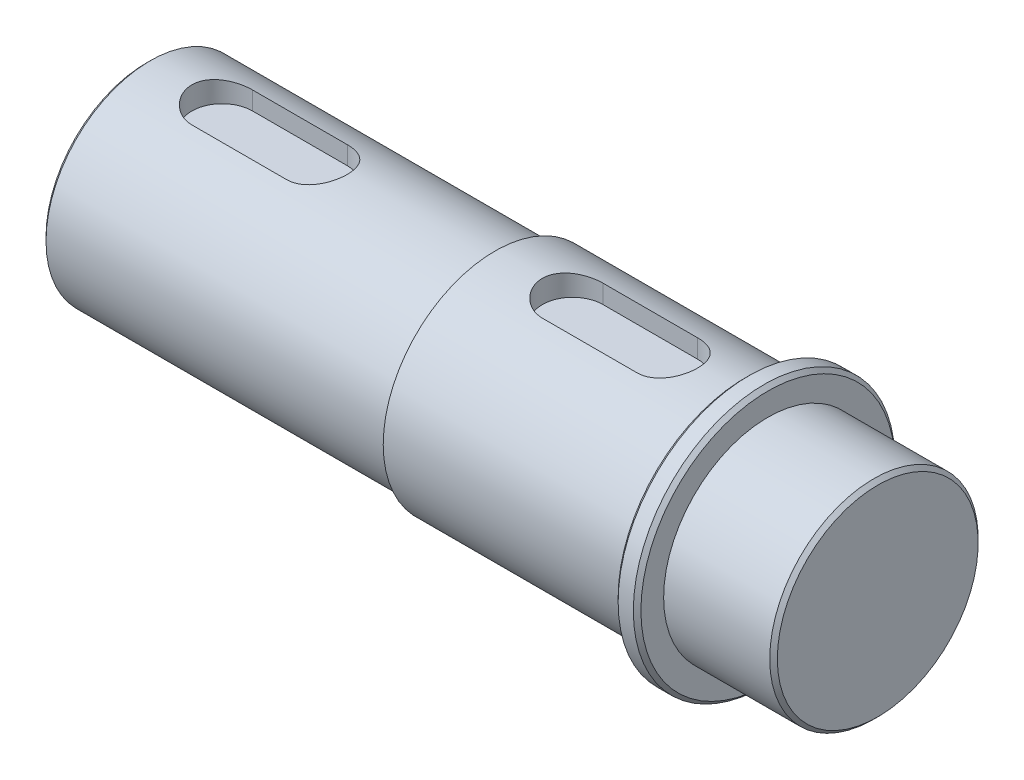
ISO-10303-21;
HEADER;
FILE_DESCRIPTION(('STEP AP214'),'2;1');
FILE_NAME('part.step','',(''),(''),'','','');
FILE_SCHEMA(('AUTOMOTIVE_DESIGN { 1 0 10303 214 1 1 1 1 }'));
ENDSEC;
DATA;
#1=APPLICATION_CONTEXT('core data for automotive mechanical design processes');
#2=APPLICATION_PROTOCOL_DEFINITION('international standard','automotive_design',2000,#1);
#3=PRODUCT_CONTEXT('',#1,'mechanical');
#4=PRODUCT('Part','Part','',(#3));
#5=PRODUCT_RELATED_PRODUCT_CATEGORY('part','',(#4));
#6=PRODUCT_DEFINITION_FORMATION('','',#4);
#7=PRODUCT_DEFINITION_CONTEXT('part definition',#1,'design');
#8=PRODUCT_DEFINITION('design','',#6,#7);
#9=PRODUCT_DEFINITION_SHAPE('','',#8);
#10=(LENGTH_UNIT() NAMED_UNIT(*) SI_UNIT(.MILLI.,.METRE.));
#11=(NAMED_UNIT(*) PLANE_ANGLE_UNIT() SI_UNIT($,.RADIAN.));
#12=(NAMED_UNIT(*) SI_UNIT($,.STERADIAN.) SOLID_ANGLE_UNIT());
#13=UNCERTAINTY_MEASURE_WITH_UNIT(LENGTH_MEASURE(1.E-05),#10,'distance_accuracy_value','');
#14=(GEOMETRIC_REPRESENTATION_CONTEXT(3) GLOBAL_UNCERTAINTY_ASSIGNED_CONTEXT((#13)) GLOBAL_UNIT_ASSIGNED_CONTEXT((#10,
#11,#12)) REPRESENTATION_CONTEXT('',''));
#15=CARTESIAN_POINT('',(0.,0.,0.));
#16=DIRECTION('',(0.,0.,1.));
#17=DIRECTION('',(1.,0.,0.));
#18=AXIS2_PLACEMENT_3D('',#15,#16,#17);
#19=CARTESIAN_POINT('',(-72.236328125,0.,0.));
#20=DIRECTION('',(-1.,0.,0.));
#21=DIRECTION('',(0.,0.,1.));
#22=AXIS2_PLACEMENT_3D('',#19,#20,#21);
#23=CYLINDRICAL_SURFACE('',#22,27.5);
#24=DIRECTION('',(-1.,0.,0.));
#25=VECTOR('',#24,1.);
#26=CARTESIAN_POINT('',(-72.236328125,26.3106442338457,-8.00000000000001));
#27=LINE('',#26,#25);
#28=CARTESIAN_POINT('',(-102.649564477172,26.3106442338457,-8.));
#29=VERTEX_POINT('',#28);
#30=CARTESIAN_POINT('',(-77.6495644771724,26.3106442338457,-8.00000000000001));
#31=VERTEX_POINT('',#30);
#32=EDGE_CURVE('E11',#29,#31,#27,.F.);
#33=ORIENTED_EDGE('',*,*,#32,.T.);
#34=CARTESIAN_POINT('',(-77.6495644771724,26.3106442338457,-8.00000000000001));
#35=CARTESIAN_POINT('',(-77.4296780071949,26.3106138464805,-8.00002941250954));
#36=CARTESIAN_POINT('',(-77.2098024997153,26.31339970325,-7.99093569772388));
#37=CARTESIAN_POINT('',(-76.7717228733047,26.3243821575892,-7.95471953682609));
#38=CARTESIAN_POINT('',(-76.5535184074534,26.3325775994905,-7.92760094142266));
#39=CARTESIAN_POINT('',(-76.1208594969072,26.3541315251911,-7.85563960143699));
#40=CARTESIAN_POINT('',(-75.9063972512507,26.3674774590875,-7.8108399333227));
#41=CARTESIAN_POINT('',(-75.4821909245238,26.3989164788629,-7.70391661710105));
#42=CARTESIAN_POINT('',(-75.2724469552904,26.4170096771374,-7.64179255882136));
#43=CARTESIAN_POINT('',(-74.8592222599551,26.4573947181872,-7.5007752502961));
#44=CARTESIAN_POINT('',(-74.6557382491932,26.4796843137982,-7.42189097222974));
#45=CARTESIAN_POINT('',(-74.2561702767961,26.5278301044113,-7.24792208748818));
#46=CARTESIAN_POINT('',(-74.0600890909107,26.5536876206464,-7.15283147638136));
#47=CARTESIAN_POINT('',(-73.6766016595221,26.6082392780648,-6.94715180070415));
#48=CARTESIAN_POINT('',(-73.4891970176153,26.63693394056,-6.83655988627862));
#49=CARTESIAN_POINT('',(-73.1242322419529,26.6963706560259,-6.60065041990191));
#50=CARTESIAN_POINT('',(-72.946672621986,26.7271128156666,-6.47533210047654));
#51=CARTESIAN_POINT('',(-72.5978569933504,26.7906616850295,-6.20724750295723));
#52=CARTESIAN_POINT('',(-72.4268967897024,26.8235016269389,-6.06410407777578));
#53=CARTESIAN_POINT('',(-72.0975525979029,26.8895667993442,-5.76409444246167));
#54=CARTESIAN_POINT('',(-71.9391688113413,26.9227920360062,-5.60722801244495));
#55=CARTESIAN_POINT('',(-71.6359611617057,26.9887294799426,-5.28074002072183));
#56=CARTESIAN_POINT('',(-71.4911397460333,27.0214415937379,-5.11111616679038));
#57=CARTESIAN_POINT('',(-71.2160502456882,27.0854611714506,-4.76020963887573));
#58=CARTESIAN_POINT('',(-71.085781746033,27.1167686754057,-4.57892729757152));
#59=CARTESIAN_POINT('',(-70.8382914521447,27.1777256203921,-4.20218325463039));
#60=CARTESIAN_POINT('',(-70.7213754203031,27.2073305358195,-4.00651327777908));
#61=CARTESIAN_POINT('',(-70.504539849176,27.2633528032334,-3.60562548789431));
#62=CARTESIAN_POINT('',(-70.4046141264575,27.2897713138544,-3.40041118318973));
#63=CARTESIAN_POINT('',(-70.2225196117825,27.3386777186889,-2.98179504822865));
#64=CARTESIAN_POINT('',(-70.14035065383,27.3611656496463,-2.76839329453302));
#65=CARTESIAN_POINT('',(-69.994480858399,27.4015581404782,-2.33494709067877));
#66=CARTESIAN_POINT('',(-69.9307794289852,27.4194628472555,-2.11490285367981));
#67=CARTESIAN_POINT('',(-69.8238851789,27.4497486455739,-1.67583141298472));
#68=CARTESIAN_POINT('',(-69.7801853830538,27.4622657370543,-1.45693695871637));
#69=CARTESIAN_POINT('',(-69.7112107726193,27.4821099190102,-1.01603367718328));
#70=CARTESIAN_POINT('',(-69.6859354061449,27.4894371649423,-0.794024943406845));
#71=CARTESIAN_POINT('',(-69.6540447895467,27.4986927278334,-0.348590871405764));
#72=CARTESIAN_POINT('',(-69.6474268628739,27.5006218191976,-0.125165740983363));
#73=CARTESIAN_POINT('',(-69.652905917945,27.4990279887972,0.321433410377634));
#74=CARTESIAN_POINT('',(-69.665002578425,27.4955051606228,0.544607435561012));
#75=CARTESIAN_POINT('',(-69.7071490319084,27.4832962687889,0.982297226132276));
#76=CARTESIAN_POINT('',(-69.736645763659,27.4747693029177,1.19687096756623));
#77=CARTESIAN_POINT('',(-69.8128894314247,27.4529077240824,1.62275603314308));
#78=CARTESIAN_POINT('',(-69.8596421501294,27.439571499512,1.83406623887595));
#79=CARTESIAN_POINT('',(-69.9699856343809,27.4084500368961,2.25182822398416));
#80=CARTESIAN_POINT('',(-70.0335707937317,27.3906662802501,2.4582815960893));
#81=CARTESIAN_POINT('',(-70.1771019190777,27.351104898212,2.86510907670465));
#82=CARTESIAN_POINT('',(-70.2570540314759,27.3293257727297,3.06548086879901));
#83=CARTESIAN_POINT('',(-70.4336467565396,27.2820848729817,3.46091415190038));
#84=CARTESIAN_POINT('',(-70.5304587576183,27.256585763757,3.65589461195646));
#85=CARTESIAN_POINT('',(-70.7394854451162,27.2027387344194,4.03708759342219));
#86=CARTESIAN_POINT('',(-70.8517054213607,27.1743898368239,4.22329707398687));
#87=CARTESIAN_POINT('',(-71.0907453506977,27.1155802508097,4.58574078126312));
#88=CARTESIAN_POINT('',(-71.2175653116948,27.0851195612476,4.76197500257392));
#89=CARTESIAN_POINT('',(-71.4849756662639,27.0228653268412,5.10341760762337));
#90=CARTESIAN_POINT('',(-71.6255664360921,26.9910717455921,5.26862568989025));
#91=CARTESIAN_POINT('',(-71.9250029868779,26.9257959685715,5.59283881339114));
#92=CARTESIAN_POINT('',(-72.0843273665496,26.892294463267,5.75139827430256));
#93=CARTESIAN_POINT('',(-72.4157352489545,26.8256711887099,6.05453947809949));
#94=CARTESIAN_POINT('',(-72.5878146077779,26.7925493001282,6.19912572581623));
#95=CARTESIAN_POINT('',(-72.9438007486166,26.7275807630162,6.47350928570368));
#96=CARTESIAN_POINT('',(-73.1277152659484,26.6957349710469,6.60329676880377));
#97=CARTESIAN_POINT('',(-73.5060183451869,26.6342666832458,6.84701637082592));
#98=CARTESIAN_POINT('',(-73.7004028005212,26.6046433264724,6.96095464428324));
#99=CARTESIAN_POINT('',(-74.1003399776535,26.5482097665725,7.17319581827482));
#100=CARTESIAN_POINT('',(-74.3059813697305,26.5214290138552,7.27133962598134));
#101=CARTESIAN_POINT('',(-74.7252144811759,26.4718440062477,7.4498360954572));
#102=CARTESIAN_POINT('',(-74.9388029226328,26.4490381334307,7.53019599955862));
#103=CARTESIAN_POINT('',(-75.3722469478454,26.408136714196,7.67240466982567));
#104=CARTESIAN_POINT('',(-75.5920957001232,26.3900362363208,7.73427282641309));
#105=CARTESIAN_POINT('',(-76.0365421472798,26.3591107233259,7.83902146376045));
#106=CARTESIAN_POINT('',(-76.2611375950409,26.3462832482518,7.88191072724793));
#107=CARTESIAN_POINT('',(-76.6796384802549,26.3278154627767,7.94336457833749));
#108=CARTESIAN_POINT('',(-76.8731209379449,26.3213881635008,7.96460439152622));
#109=CARTESIAN_POINT('',(-77.2609187319362,26.312796865776,7.99291944032766));
#110=CARTESIAN_POINT('',(-77.4552323694083,26.3106264443285,8.00001601625351));
#111=CARTESIAN_POINT('',(-77.6495644771724,26.3106442338457,8.));
#112=B_SPLINE_CURVE_WITH_KNOTS('',3,(#34,#35,#36,#37,#38,#39,#40,#41,#42,#43,#44,#45,#46,#47,
#48,#49,#50,#51,#52,#53,#54,#55,#56,#57,#58,#59,#60,#61,#62,#63,#64,#65,#66,#67,#68,#69,#70,#71,
#72,#73,#74,#75,#76,#77,#78,#79,#80,#81,#82,#83,#84,#85,#86,#87,#88,#89,#90,#91,#92,#93,#94,#95,
#96,#97,#98,#99,#100,#101,#102,#103,#104,#105,#106,#107,#108,#109,#110,#111),.UNSPECIFIED.,.F.,
.F.,(4,2,2,2,2,2,2,2,2,2,2,2,2,2,2,2,2,2,2,2,2,2,2,2,2,2,2,2,2,2,2,2,2,2,2,2,2,2,4),(0.,
0.659436943554262,1.31873305489964,1.97643273881418,2.63414799575145,3.29151204385043,
3.94912017630673,4.60684936645656,5.26461284971652,5.93997685054219,6.61535167472507,
7.29084813997373,7.96632533824111,8.65504200191302,9.3435074758537,10.0319665135188,
10.7204034817235,11.3902655139289,12.0601074802365,12.7298533478211,13.3995877183439,
14.0491017024096,14.6988335443704,15.348349258952,15.9981093399168,16.6549076019857,
17.311931920769,17.968956595273,18.6259992264999,19.3069904712947,19.9877614334311,
20.668981949418,21.3499371922363,22.0373719853152,22.72452630958,23.4109575362285,
24.0970707749295,24.6807726695567,25.2635931648055),.UNSPECIFIED.);
#113=CARTESIAN_POINT('',(-77.6495644771724,26.3106442338457,8.));
#114=VERTEX_POINT('',#113);
#115=EDGE_CURVE('E271',#31,#114,#112,.T.);
#116=ORIENTED_EDGE('',*,*,#115,.T.);
#117=DIRECTION('',(-1.,0.,0.));
#118=VECTOR('',#117,1.);
#119=CARTESIAN_POINT('',(-72.236328125,26.3106442338457,8.));
#120=LINE('',#119,#118);
#121=CARTESIAN_POINT('',(-102.649564477172,26.3106442338457,8.));
#122=VERTEX_POINT('',#121);
#123=EDGE_CURVE('E48',#114,#122,#120,.T.);
#124=ORIENTED_EDGE('',*,*,#123,.T.);
#125=CARTESIAN_POINT('',(-102.649564477172,26.3106442338457,8.00000000000001));
#126=CARTESIAN_POINT('',(-102.86945094715,26.3106138464805,8.00002941250955));
#127=CARTESIAN_POINT('',(-103.08932645463,26.31339970325,7.99093569772388));
#128=CARTESIAN_POINT('',(-103.52740608104,26.3243821575892,7.9547195368261));
#129=CARTESIAN_POINT('',(-103.745610546891,26.3325775994905,7.92760094142266));
#130=CARTESIAN_POINT('',(-104.178269457438,26.3541315251911,7.85563960143699));
#131=CARTESIAN_POINT('',(-104.392731703094,26.3674774590875,7.8108399333227));
#132=CARTESIAN_POINT('',(-104.816938029821,26.3989164788629,7.70391661710106));
#133=CARTESIAN_POINT('',(-105.026681999054,26.4170096771374,7.64179255882136));
#134=CARTESIAN_POINT('',(-105.43990669439,26.4573947181872,7.5007752502961));
#135=CARTESIAN_POINT('',(-105.643390705152,26.4796843137982,7.42189097222975));
#136=CARTESIAN_POINT('',(-106.042958677549,26.5278301044113,7.2479220874882));
#137=CARTESIAN_POINT('',(-106.239039863434,26.5536876206464,7.15283147638138));
#138=CARTESIAN_POINT('',(-106.622527294823,26.6082392780648,6.94715180070416));
#139=CARTESIAN_POINT('',(-106.80993193673,26.63693394056,6.83655988627864));
#140=CARTESIAN_POINT('',(-107.174896712392,26.6963706560259,6.60065041990191));
#141=CARTESIAN_POINT('',(-107.352456332359,26.7271128156666,6.47533210047654));
#142=CARTESIAN_POINT('',(-107.701271960994,26.7906616850295,6.20724750295723));
#143=CARTESIAN_POINT('',(-107.872232164642,26.8235016269389,6.06410407777578));
#144=CARTESIAN_POINT('',(-108.201576356442,26.8895667993442,5.76409444246167));
#145=CARTESIAN_POINT('',(-108.359960143003,26.9227920360062,5.60722801244496));
#146=CARTESIAN_POINT('',(-108.663167792639,26.9887294799426,5.28074002072183));
#147=CARTESIAN_POINT('',(-108.807989208311,27.0214415937379,5.11111616679039));
#148=CARTESIAN_POINT('',(-109.083078708657,27.0854611714506,4.76020963887574));
#149=CARTESIAN_POINT('',(-109.213347208312,27.1167686754057,4.57892729757152));
#150=CARTESIAN_POINT('',(-109.4608375022,27.1777256203921,4.20218325463039));
#151=CARTESIAN_POINT('',(-109.577753534042,27.2073305358195,4.00651327777909));
#152=CARTESIAN_POINT('',(-109.794589105169,27.2633528032334,3.60562548789431));
#153=CARTESIAN_POINT('',(-109.894514827887,27.2897713138544,3.40041118318973));
#154=CARTESIAN_POINT('',(-110.076609342562,27.3386777186889,2.98179504822865));
#155=CARTESIAN_POINT('',(-110.158778300515,27.3611656496463,2.76839329453302));
#156=CARTESIAN_POINT('',(-110.304648095946,27.4015581404782,2.33494709067877));
#157=CARTESIAN_POINT('',(-110.36834952536,27.4194628472555,2.11490285367982));
#158=CARTESIAN_POINT('',(-110.475243775445,27.4497486455739,1.67583141298472));
#159=CARTESIAN_POINT('',(-110.518943571291,27.4622657370543,1.45693695871637));
#160=CARTESIAN_POINT('',(-110.587918181726,27.4821099190102,1.01603367718329));
#161=CARTESIAN_POINT('',(-110.6131935482,27.4894371649423,0.794024943406851));
#162=CARTESIAN_POINT('',(-110.645084164798,27.4986927278334,0.348590871405771));
#163=CARTESIAN_POINT('',(-110.651702091471,27.5006218191976,0.12516574098337));
#164=CARTESIAN_POINT('',(-110.6462230364,27.4990279887972,-0.321433410377626));
#165=CARTESIAN_POINT('',(-110.63412637592,27.4955051606228,-0.544607435561004));
#166=CARTESIAN_POINT('',(-110.591979922436,27.4832962687889,-0.982297226132268));
#167=CARTESIAN_POINT('',(-110.562483190686,27.4747693029177,-1.19687096756622));
#168=CARTESIAN_POINT('',(-110.48623952292,27.4529077240824,-1.62275603314307));
#169=CARTESIAN_POINT('',(-110.439486804215,27.439571499512,-1.83406623887594));
#170=CARTESIAN_POINT('',(-110.329143319964,27.4084500368961,-2.25182822398415));
#171=CARTESIAN_POINT('',(-110.265558160613,27.3906662802501,-2.4582815960893));
#172=CARTESIAN_POINT('',(-110.122027035267,27.351104898212,-2.86510907670465));
#173=CARTESIAN_POINT('',(-110.042074922869,27.3293257727297,-3.06548086879901));
#174=CARTESIAN_POINT('',(-109.865482197805,27.2820848729817,-3.46091415190038));
#175=CARTESIAN_POINT('',(-109.768670196727,27.256585763757,-3.65589461195646));
#176=CARTESIAN_POINT('',(-109.559643509229,27.2027387344194,-4.03708759342219));
#177=CARTESIAN_POINT('',(-109.447423532984,27.1743898368239,-4.22329707398687));
#178=CARTESIAN_POINT('',(-109.208383603647,27.1155802508097,-4.58574078126311));
#179=CARTESIAN_POINT('',(-109.08156364265,27.0851195612476,-4.76197500257391));
#180=CARTESIAN_POINT('',(-108.814153288081,27.0228653268412,-5.10341760762337));
#181=CARTESIAN_POINT('',(-108.673562518253,26.9910717455921,-5.26862568989025));
#182=CARTESIAN_POINT('',(-108.374125967467,26.9257959685715,-5.59283881339113));
#183=CARTESIAN_POINT('',(-108.214801587795,26.892294463267,-5.75139827430255));
#184=CARTESIAN_POINT('',(-107.88339370539,26.8256711887099,-6.05453947809948));
#185=CARTESIAN_POINT('',(-107.711314346567,26.7925493001282,-6.19912572581623));
#186=CARTESIAN_POINT('',(-107.355328205728,26.7275807630162,-6.47350928570367));
#187=CARTESIAN_POINT('',(-107.171413688396,26.6957349710469,-6.60329676880377));
#188=CARTESIAN_POINT('',(-106.793110609158,26.6342666832458,-6.84701637082592));
#189=CARTESIAN_POINT('',(-106.598726153824,26.6046433264724,-6.96095464428324));
#190=CARTESIAN_POINT('',(-106.198788976691,26.5482097665725,-7.17319581827481));
#191=CARTESIAN_POINT('',(-105.993147584614,26.5214290138552,-7.27133962598134));
#192=CARTESIAN_POINT('',(-105.573914473169,26.4718440062477,-7.44983609545719));
#193=CARTESIAN_POINT('',(-105.360326031712,26.4490381334307,-7.53019599955861));
#194=CARTESIAN_POINT('',(-104.926882006499,26.408136714196,-7.67240466982567));
#195=CARTESIAN_POINT('',(-104.707033254222,26.3900362363208,-7.73427282641309));
#196=CARTESIAN_POINT('',(-104.262586807065,26.3591107233259,-7.83902146376045));
#197=CARTESIAN_POINT('',(-104.037991359304,26.3462832482518,-7.88191072724792));
#198=CARTESIAN_POINT('',(-103.61949047409,26.3278154627766,-7.94336457833749));
#199=CARTESIAN_POINT('',(-103.4260080164,26.3213881635008,-7.96460439152622));
#200=CARTESIAN_POINT('',(-103.038210222409,26.312796865776,-7.99291944032765));
#201=CARTESIAN_POINT('',(-102.843896584937,26.3106264443285,-8.0000160162535));
#202=CARTESIAN_POINT('',(-102.649564477172,26.3106442338457,-8.));
#203=B_SPLINE_CURVE_WITH_KNOTS('',3,(#125,#126,#127,#128,#129,#130,#131,#132,#133,#134,#135,
#136,#137,#138,#139,#140,#141,#142,#143,#144,#145,#146,#147,#148,#149,#150,#151,#152,#153,#154,
#155,#156,#157,#158,#159,#160,#161,#162,#163,#164,#165,#166,#167,#168,#169,#170,#171,#172,#173,
#174,#175,#176,#177,#178,#179,#180,#181,#182,#183,#184,#185,#186,#187,#188,#189,#190,#191,#192,
#193,#194,#195,#196,#197,#198,#199,#200,#201,#202),.UNSPECIFIED.,.F.,.F.,(4,2,2,2,2,2,2,2,2,2,2,
2,2,2,2,2,2,2,2,2,2,2,2,2,2,2,2,2,2,2,2,2,2,2,2,2,2,2,4),(0.,0.659436943554262,1.31873305489964,
1.97643273881418,2.63414799575145,3.29151204385042,3.9491201763067,4.60684936645656,
5.26461284971653,5.93997685054219,6.61535167472507,7.29084813997373,7.96632533824112,
8.65504200191302,9.3435074758537,10.0319665135188,10.7204034817235,11.3902655139289,
12.0601074802365,12.7298533478211,13.3995877183439,14.0491017024096,14.6988335443704,
15.348349258952,15.9981093399168,16.6549076019857,17.311931920769,17.968956595273,
18.6259992264998,19.3069904712947,19.9877614334311,20.668981949418,21.3499371922363,
22.0373719853152,22.72452630958,23.4109575362285,24.0970707749295,24.6807726695567,
25.2635931648055),.UNSPECIFIED.);
#204=EDGE_CURVE('E55',#122,#29,#203,.T.);
#205=ORIENTED_EDGE('',*,*,#204,.T.);
#206=EDGE_LOOP('',(#33,#116,#124,#205));
#207=FACE_BOUND('',#206,.T.);
#208=CARTESIAN_POINT('',(-121.649564477172,0.,0.));
#209=DIRECTION('',(-1.,0.,0.));
#210=DIRECTION('',(0.,0.,1.));
#211=AXIS2_PLACEMENT_3D('',#208,#209,#210);
#212=CIRCLE('',#211,27.5);
#213=CARTESIAN_POINT('',(-121.649564477172,0.,27.5));
#214=VERTEX_POINT('',#213);
#215=EDGE_CURVE('E308',#214,#214,#212,.F.);
#216=ORIENTED_EDGE('',*,*,#215,.T.);
#217=EDGE_LOOP('',(#216));
#218=FACE_BOUND('',#217,.T.);
#219=CARTESIAN_POINT('',(-30.6599694272612,0.,0.));
#220=DIRECTION('',(-1.,0.,0.));
#221=DIRECTION('',(0.,0.,1.));
#222=AXIS2_PLACEMENT_3D('',#219,#220,#221);
#223=CIRCLE('',#222,27.5);
#224=CARTESIAN_POINT('',(-30.6599694272612,0.,27.5));
#225=VERTEX_POINT('',#224);
#226=EDGE_CURVE('E186',#225,#225,#223,.T.);
#227=ORIENTED_EDGE('',*,*,#226,.T.);
#228=EDGE_LOOP('',(#227));
#229=FACE_BOUND('',#228,.T.);
#230=ADVANCED_FACE('F39',(#207,#218,#229),#23,.T.);
#231=CARTESIAN_POINT('',(-30.6599694272612,27.5,0.));
#232=DIRECTION('',(1.,0.,0.));
#233=DIRECTION('',(0.,0.,-1.));
#234=AXIS2_PLACEMENT_3D('',#231,#232,#233);
#235=PLANE('',#234);
#236=ORIENTED_EDGE('',*,*,#226,.F.);
#237=EDGE_LOOP('',(#236));
#238=FACE_BOUND('',#237,.T.);
#239=CARTESIAN_POINT('',(-30.6599694272612,0.,0.));
#240=DIRECTION('',(-1.,0.,0.));
#241=DIRECTION('',(0.,0.,1.));
#242=AXIS2_PLACEMENT_3D('',#239,#240,#241);
#243=CIRCLE('',#242,29.5);
#244=CARTESIAN_POINT('',(-30.6599694272612,0.,29.5));
#245=VERTEX_POINT('',#244);
#246=EDGE_CURVE('E183',#245,#245,#243,.T.);
#247=ORIENTED_EDGE('',*,*,#246,.T.);
#248=EDGE_LOOP('',(#247));
#249=FACE_BOUND('',#248,.T.);
#250=ADVANCED_FACE('F257',(#238,#249),#235,.F.);
#251=CARTESIAN_POINT('',(-72.236328125,0.,0.));
#252=DIRECTION('',(-1.,0.,0.));
#253=DIRECTION('',(0.,0.,1.));
#254=AXIS2_PLACEMENT_3D('',#251,#252,#253);
#255=CYLINDRICAL_SURFACE('',#254,29.5);
#256=DIRECTION('',(-1.,0.,0.));
#257=VECTOR('',#256,1.);
#258=CARTESIAN_POINT('',(-72.236328125,28.3945417290014,-8.));
#259=LINE('',#258,#257);
#260=CARTESIAN_POINT('',(-10.16796875,28.3945417290014,-8.));
#261=VERTEX_POINT('',#260);
#262=CARTESIAN_POINT('',(14.83203125,28.3945417290014,-8.));
#263=VERTEX_POINT('',#262);
#264=EDGE_CURVE('E304',#261,#263,#259,.F.);
#265=ORIENTED_EDGE('',*,*,#264,.T.);
#266=CARTESIAN_POINT('',(14.83203125,28.3945417290014,-8.));
#267=CARTESIAN_POINT('',(15.0525953036408,28.3945137300031,-8.00002873258341));
#268=CARTESIAN_POINT('',(15.2731494297406,28.3971107416837,-7.99087969855075));
#269=CARTESIAN_POINT('',(15.7125949563254,28.407350729619,-7.9544380167304));
#270=CARTESIAN_POINT('',(15.9314866658295,28.4149927436477,-7.92714882878074));
#271=CARTESIAN_POINT('',(16.3655721709091,28.4350967022898,-7.85471830953825));
#272=CARTESIAN_POINT('',(16.5807730378087,28.4475480143213,-7.80961635448144));
#273=CARTESIAN_POINT('',(17.0064530282195,28.476886215605,-7.70195312233185));
#274=CARTESIAN_POINT('',(17.216932063586,28.4937731875852,-7.63939151960385));
#275=CARTESIAN_POINT('',(17.6316340064883,28.5314762838,-7.49734930321021));
#276=CARTESIAN_POINT('',(17.8358595212011,28.5522907439577,-7.4178758532798));
#277=CARTESIAN_POINT('',(18.2368732528747,28.5972591639657,-7.24257930082531));
#278=CARTESIAN_POINT('',(18.4336586838016,28.6214143593302,-7.14675014633814));
#279=CARTESIAN_POINT('',(18.8184772700603,28.6723798834938,-6.93945378728573));
#280=CARTESIAN_POINT('',(19.0065094529764,28.6991905062596,-6.82798485076128));
#281=CARTESIAN_POINT('',(19.3726379397121,28.7547275906951,-6.59018549073986));
#282=CARTESIAN_POINT('',(19.5507337635352,28.7834541447709,-6.46385435020784));
#283=CARTESIAN_POINT('',(19.8999012431933,28.8427290154732,-6.19406902336904));
#284=CARTESIAN_POINT('',(20.0707139618412,28.8733041389878,-6.05028549182505));
#285=CARTESIAN_POINT('',(20.3996986018352,28.9348025736478,-5.74898560012509));
#286=CARTESIAN_POINT('',(20.5578703436484,28.9657258897312,-5.59146904499271));
#287=CARTESIAN_POINT('',(20.8605744155748,29.0270797186178,-5.263690912739));
#288=CARTESIAN_POINT('',(21.0051043380288,29.0575101436478,-5.09342709531302));
#289=CARTESIAN_POINT('',(21.279523868633,29.1170433893146,-4.74127275998858));
#290=CARTESIAN_POINT('',(21.4094138839933,29.1461462468643,-4.55938256569937));
#291=CARTESIAN_POINT('',(21.6557151650685,29.2027061877709,-4.1819805684317));
#292=CARTESIAN_POINT('',(21.7718622739818,29.2301272531681,-3.98629081646132));
#293=CARTESIAN_POINT('',(21.9871683617023,29.2819922328797,-3.58549056321194));
#294=CARTESIAN_POINT('',(22.0863334794982,29.3064372221177,-3.3803835004372));
#295=CARTESIAN_POINT('',(22.2669347461933,29.3516633687544,-2.96211089448301));
#296=CARTESIAN_POINT('',(22.3483707758871,29.3724445015181,-2.74894529713157));
#297=CARTESIAN_POINT('',(22.4928233744169,29.4097409387248,-2.3160991123042));
#298=CARTESIAN_POINT('',(22.5558404522017,29.4262563610355,-2.09641870502896));
#299=CARTESIAN_POINT('',(22.6616340817183,29.45420410269,-1.65743307467072));
#300=CARTESIAN_POINT('',(22.7048537342717,29.4657473150411,-1.4382416530421));
#301=CARTESIAN_POINT('',(22.7728261094449,29.4839812126967,-0.996816150517385));
#302=CARTESIAN_POINT('',(22.7975793097422,29.4906720235197,-0.774582148476111));
#303=CARTESIAN_POINT('',(22.8283955843607,29.4990105258922,-0.328754936806277));
#304=CARTESIAN_POINT('',(22.834460950463,29.5006588358282,-0.105161897213193));
#305=CARTESIAN_POINT('',(22.8278526401904,29.4988669076861,0.341724870778752));
#306=CARTESIAN_POINT('',(22.8151792403925,29.4954267447119,0.56501860354658));
#307=CARTESIAN_POINT('',(22.7717885675489,29.4837128970159,1.00377738828183));
#308=CARTESIAN_POINT('',(22.7415545338228,29.4755686918384,1.21929390138203));
#309=CARTESIAN_POINT('',(22.6636737861096,29.4547656137756,1.64701010106457));
#310=CARTESIAN_POINT('',(22.6160212110556,29.4421052212985,1.85920864611158));
#311=CARTESIAN_POINT('',(22.5037155199283,29.4126130768089,2.27868140448176));
#312=CARTESIAN_POINT('',(22.4390680674898,29.3957827145688,2.48595723328236));
#313=CARTESIAN_POINT('',(22.2932493042053,29.3583856897314,2.8943489967999));
#314=CARTESIAN_POINT('',(22.2120717990198,29.33781762681,3.09546258973136));
#315=CARTESIAN_POINT('',(22.03294442662,29.293268077745,3.49208573877809));
#316=CARTESIAN_POINT('',(21.9348377344711,29.2692550654282,3.68752090181133));
#317=CARTESIAN_POINT('',(21.7230945462069,29.2185931719764,4.06951516671499));
#318=CARTESIAN_POINT('',(21.6094527086951,29.1919433851224,4.25607118582671));
#319=CARTESIAN_POINT('',(21.3674554311723,29.1367104574649,4.61907055779654));
#320=CARTESIAN_POINT('',(21.2391003391136,29.1081273623886,4.79551414965446));
#321=CARTESIAN_POINT('',(20.968520651498,29.0497685728195,5.13721661246417));
#322=CARTESIAN_POINT('',(20.8262957293187,29.0199928502512,5.30247521986399));
#323=CARTESIAN_POINT('',(20.5241419426048,28.9590666760117,5.6258678959394));
#324=CARTESIAN_POINT('',(20.3637936858452,28.9279026321938,5.78360781860587));
#325=CARTESIAN_POINT('',(20.0304001948058,28.8660046543207,6.08501807315219));
#326=CARTESIAN_POINT('',(19.8573591346115,28.8352705827909,6.22869299440665));
#327=CARTESIAN_POINT('',(19.4995356157608,28.7750670059534,6.50115394051208));
#328=CARTESIAN_POINT('',(19.3147455767902,28.7455983380362,6.62993019871198));
#329=CARTESIAN_POINT('',(18.9348025821494,28.6888039309242,6.87153031518473));
#330=CARTESIAN_POINT('',(18.7396536740716,28.6614773649188,6.98436034203569));
#331=CARTESIAN_POINT('',(18.3387129402743,28.6095615938841,7.19407741925682));
#332=CARTESIAN_POINT('',(18.1328520033845,28.5849945649804,7.29083794101526));
#333=CARTESIAN_POINT('',(17.7133658780772,28.53959773251,7.466565450161));
#334=CARTESIAN_POINT('',(17.4997438598292,28.5187664232022,7.54553960992333));
#335=CARTESIAN_POINT('',(17.0664208107437,28.4815020465348,7.68500188949053));
#336=CARTESIAN_POINT('',(16.8467263574802,28.4650644112832,7.74550921773185));
#337=CARTESIAN_POINT('',(16.4027674100438,28.4370912365806,7.84758805773309));
#338=CARTESIAN_POINT('',(16.1785050936941,28.4255534158352,7.88916838232689));
#339=CARTESIAN_POINT('',(15.767170699824,28.4093314788753,7.94736790148469));
#340=CARTESIAN_POINT('',(15.5805674363623,28.4037940567289,7.96710871747521));
#341=CARTESIAN_POINT('',(15.2066582081017,28.3963951683408,7.99342086246526));
#342=CARTESIAN_POINT('',(15.0193538110086,28.39452793171,8.00001286471366));
#343=CARTESIAN_POINT('',(14.83203125,28.3945417290014,8.));
#344=B_SPLINE_CURVE_WITH_KNOTS('',3,(#266,#267,#268,#269,#270,#271,#272,#273,#274,#275,#276,
#277,#278,#279,#280,#281,#282,#283,#284,#285,#286,#287,#288,#289,#290,#291,#292,#293,#294,#295,
#296,#297,#298,#299,#300,#301,#302,#303,#304,#305,#306,#307,#308,#309,#310,#311,#312,#313,#314,
#315,#316,#317,#318,#319,#320,#321,#322,#323,#324,#325,#326,#327,#328,#329,#330,#331,#332,#333,
#334,#335,#336,#337,#338,#339,#340,#341,#342,#343),.UNSPECIFIED.,.F.,.F.,(4,2,2,2,2,2,2,2,2,2,2,
2,2,2,2,2,2,2,2,2,2,2,2,2,2,2,2,2,2,2,2,2,2,2,2,2,2,2,4),(0.,0.661471996831724,1.32281786851692,
1.98270990380464,2.64261424738484,3.30223961475158,3.96210958897727,4.62205269537675,
5.28202765415496,5.9573191339439,6.63262020283403,7.30804023433997,7.98344147434466,
8.67022932114663,9.3567683676724,10.043312030151,10.7298367204022,11.400138654397,
12.0704232488793,12.740625639786,13.4108181388628,14.0633874626267,14.7161765681992,
15.3687484034409,16.0215652297369,16.6807905014496,17.3402430051266,17.9996799166943,
18.6591323611789,19.3395729481378,20.0197907637767,20.7004519918184,21.3808491905677,
22.0663728822177,22.7516196385484,23.4361511810015,24.1203636634842,24.6830572329028,
25.2448654066762),.UNSPECIFIED.);
#345=CARTESIAN_POINT('',(14.83203125,28.3945417290014,8.));
#346=VERTEX_POINT('',#345);
#347=EDGE_CURVE('E189',#263,#346,#344,.T.);
#348=ORIENTED_EDGE('',*,*,#347,.T.);
#349=DIRECTION('',(-1.,0.,0.));
#350=VECTOR('',#349,1.);
#351=CARTESIAN_POINT('',(-72.236328125,28.3945417290014,8.));
#352=LINE('',#351,#350);
#353=CARTESIAN_POINT('',(-10.16796875,28.3945417290014,8.));
#354=VERTEX_POINT('',#353);
#355=EDGE_CURVE('E301',#346,#354,#352,.T.);
#356=ORIENTED_EDGE('',*,*,#355,.T.);
#357=CARTESIAN_POINT('',(-10.16796875,28.3945417290014,8.));
#358=CARTESIAN_POINT('',(-10.3885328036408,28.3945137300031,8.00002873258342));
#359=CARTESIAN_POINT('',(-10.6090869297406,28.3971107416837,7.99087969855075));
#360=CARTESIAN_POINT('',(-11.0485324563254,28.407350729619,7.95443801673041));
#361=CARTESIAN_POINT('',(-11.2674241658295,28.4149927436477,7.92714882878074));
#362=CARTESIAN_POINT('',(-11.7015096709091,28.4350967022898,7.85471830953825));
#363=CARTESIAN_POINT('',(-11.9167105378087,28.4475480143213,7.80961635448144));
#364=CARTESIAN_POINT('',(-12.3423905282195,28.476886215605,7.70195312233185));
#365=CARTESIAN_POINT('',(-12.552869563586,28.4937731875852,7.63939151960385));
#366=CARTESIAN_POINT('',(-12.9675715064883,28.5314762838,7.49734930321021));
#367=CARTESIAN_POINT('',(-13.1717970212011,28.5522907439577,7.4178758532798));
#368=CARTESIAN_POINT('',(-13.5728107528747,28.5972591639657,7.24257930082531));
#369=CARTESIAN_POINT('',(-13.7695961838016,28.6214143593302,7.14675014633813));
#370=CARTESIAN_POINT('',(-14.1544147700603,28.6723798834938,6.93945378728573));
#371=CARTESIAN_POINT('',(-14.3424469529764,28.6991905062596,6.82798485076127));
#372=CARTESIAN_POINT('',(-14.7085754397121,28.7547275906951,6.59018549073986));
#373=CARTESIAN_POINT('',(-14.8866712635352,28.7834541447709,6.46385435020784));
#374=CARTESIAN_POINT('',(-15.2358387431934,28.8427290154732,6.19406902336904));
#375=CARTESIAN_POINT('',(-15.4066514618412,28.8733041389878,6.05028549182505));
#376=CARTESIAN_POINT('',(-15.7356361018352,28.9348025736478,5.74898560012509));
#377=CARTESIAN_POINT('',(-15.8938078436484,28.9657258897312,5.59146904499271));
#378=CARTESIAN_POINT('',(-16.1965119155748,29.0270797186178,5.263690912739));
#379=CARTESIAN_POINT('',(-16.3410418380288,29.0575101436478,5.09342709531302));
#380=CARTESIAN_POINT('',(-16.615461368633,29.1170433893146,4.74127275998858));
#381=CARTESIAN_POINT('',(-16.7453513839933,29.1461462468643,4.55938256569937));
#382=CARTESIAN_POINT('',(-16.9916526650685,29.2027061877709,4.1819805684317));
#383=CARTESIAN_POINT('',(-17.1077997739818,29.2301272531681,3.98629081646133));
#384=CARTESIAN_POINT('',(-17.3231058617023,29.2819922328797,3.58549056321194));
#385=CARTESIAN_POINT('',(-17.4222709794982,29.3064372221177,3.3803835004372));
#386=CARTESIAN_POINT('',(-17.6028722461933,29.3516633687544,2.96211089448301));
#387=CARTESIAN_POINT('',(-17.6843082758871,29.3724445015181,2.74894529713157));
#388=CARTESIAN_POINT('',(-17.8287608744169,29.4097409387248,2.3160991123042));
#389=CARTESIAN_POINT('',(-17.8917779522017,29.4262563610355,2.09641870502896));
#390=CARTESIAN_POINT('',(-17.9975715817183,29.45420410269,1.65743307467072));
#391=CARTESIAN_POINT('',(-18.0407912342717,29.4657473150411,1.4382416530421));
#392=CARTESIAN_POINT('',(-18.1087636094449,29.4839812126967,0.996816150517384));
#393=CARTESIAN_POINT('',(-18.1335168097423,29.4906720235197,0.774582148476111));
#394=CARTESIAN_POINT('',(-18.1643330843607,29.4990105258922,0.328754936806277));
#395=CARTESIAN_POINT('',(-18.170398450463,29.5006588358282,0.105161897213193));
#396=CARTESIAN_POINT('',(-18.1637901401904,29.4988669076861,-0.341724870778753));
#397=CARTESIAN_POINT('',(-18.1511167403925,29.4954267447119,-0.565018603546581));
#398=CARTESIAN_POINT('',(-18.1077260675489,29.4837128970159,-1.00377738828183));
#399=CARTESIAN_POINT('',(-18.0774920338228,29.4755686918384,-1.21929390138203));
#400=CARTESIAN_POINT('',(-17.9996112861096,29.4547656137756,-1.64701010106457));
#401=CARTESIAN_POINT('',(-17.9519587110557,29.4421052212985,-1.85920864611158));
#402=CARTESIAN_POINT('',(-17.8396530199283,29.4126130768089,-2.27868140448176));
#403=CARTESIAN_POINT('',(-17.7750055674898,29.3957827145688,-2.48595723328236));
#404=CARTESIAN_POINT('',(-17.6291868042053,29.3583856897314,-2.8943489967999));
#405=CARTESIAN_POINT('',(-17.5480092990198,29.33781762681,-3.09546258973136));
#406=CARTESIAN_POINT('',(-17.36888192662,29.293268077745,-3.49208573877809));
#407=CARTESIAN_POINT('',(-17.2707752344711,29.2692550654282,-3.68752090181133));
#408=CARTESIAN_POINT('',(-17.0590320462069,29.2185931719764,-4.06951516671498));
#409=CARTESIAN_POINT('',(-16.9453902086951,29.1919433851224,-4.2560711858267));
#410=CARTESIAN_POINT('',(-16.7033929311723,29.1367104574649,-4.61907055779654));
#411=CARTESIAN_POINT('',(-16.5750378391136,29.1081273623886,-4.79551414965446));
#412=CARTESIAN_POINT('',(-16.304458151498,29.0497685728195,-5.13721661246417));
#413=CARTESIAN_POINT('',(-16.1622332293187,29.0199928502512,-5.30247521986399));
#414=CARTESIAN_POINT('',(-15.8600794426048,28.9590666760117,-5.6258678959394));
#415=CARTESIAN_POINT('',(-15.6997311858453,28.9279026321938,-5.78360781860587));
#416=CARTESIAN_POINT('',(-15.3663376948058,28.8660046543207,-6.08501807315219));
#417=CARTESIAN_POINT('',(-15.1932966346115,28.8352705827909,-6.22869299440664));
#418=CARTESIAN_POINT('',(-14.8354731157608,28.7750670059534,-6.50115394051207));
#419=CARTESIAN_POINT('',(-14.6506830767903,28.7455983380362,-6.62993019871198));
#420=CARTESIAN_POINT('',(-14.2707400821494,28.6888039309242,-6.87153031518473));
#421=CARTESIAN_POINT('',(-14.0755911740717,28.6614773649188,-6.98436034203569));
#422=CARTESIAN_POINT('',(-13.6746504402743,28.6095615938841,-7.19407741925682));
#423=CARTESIAN_POINT('',(-13.4687895033845,28.5849945649804,-7.29083794101526));
#424=CARTESIAN_POINT('',(-13.0493033780772,28.53959773251,-7.466565450161));
#425=CARTESIAN_POINT('',(-12.8356813598292,28.5187664232022,-7.54553960992333));
#426=CARTESIAN_POINT('',(-12.4023583107437,28.4815020465348,-7.68500188949053));
#427=CARTESIAN_POINT('',(-12.1826638574802,28.4650644112832,-7.74550921773185));
#428=CARTESIAN_POINT('',(-11.7387049100438,28.4370912365806,-7.84758805773309));
#429=CARTESIAN_POINT('',(-11.5144425936941,28.4255534158352,-7.88916838232689));
#430=CARTESIAN_POINT('',(-11.103108199824,28.4093314788753,-7.94736790148469));
#431=CARTESIAN_POINT('',(-10.9165049363623,28.4037940567289,-7.96710871747521));
#432=CARTESIAN_POINT('',(-10.5425957081017,28.3963951683408,-7.99342086246526));
#433=CARTESIAN_POINT('',(-10.3552913110086,28.39452793171,-8.00001286471366));
#434=CARTESIAN_POINT('',(-10.16796875,28.3945417290014,-8.));
#435=B_SPLINE_CURVE_WITH_KNOTS('',3,(#357,#358,#359,#360,#361,#362,#363,#364,#365,#366,#367,
#368,#369,#370,#371,#372,#373,#374,#375,#376,#377,#378,#379,#380,#381,#382,#383,#384,#385,#386,
#387,#388,#389,#390,#391,#392,#393,#394,#395,#396,#397,#398,#399,#400,#401,#402,#403,#404,#405,
#406,#407,#408,#409,#410,#411,#412,#413,#414,#415,#416,#417,#418,#419,#420,#421,#422,#423,#424,
#425,#426,#427,#428,#429,#430,#431,#432,#433,#434),.UNSPECIFIED.,.F.,.F.,(4,2,2,2,2,2,2,2,2,2,2,
2,2,2,2,2,2,2,2,2,2,2,2,2,2,2,2,2,2,2,2,2,2,2,2,2,2,2,4),(0.,0.661471996831722,1.32281786851692,
1.98270990380464,2.64261424738484,3.30223961475158,3.96210958897728,4.62205269537675,
5.28202765415496,5.9573191339439,6.63262020283403,7.30804023433997,7.98344147434466,
8.67022932114663,9.3567683676724,10.043312030151,10.7298367204022,11.400138654397,
12.0704232488793,12.740625639786,13.4108181388628,14.0633874626267,14.7161765681992,
15.3687484034409,16.0215652297369,16.6807905014496,17.3402430051266,17.9996799166943,
18.6591323611789,19.3395729481378,20.0197907637767,20.7004519918184,21.3808491905677,
22.0663728822177,22.7516196385484,23.4361511810015,24.1203636634842,24.6830572329028,
25.2448654066762),.UNSPECIFIED.);
#436=EDGE_CURVE('E63',#354,#261,#435,.T.);
#437=ORIENTED_EDGE('',*,*,#436,.T.);
#438=EDGE_LOOP('',(#265,#348,#356,#437));
#439=FACE_BOUND('',#438,.T.);
#440=ORIENTED_EDGE('',*,*,#246,.F.);
#441=EDGE_LOOP('',(#440));
#442=FACE_BOUND('',#441,.T.);
#443=CARTESIAN_POINT('',(35.33203125,0.,0.));
#444=DIRECTION('',(-1.,0.,0.));
#445=DIRECTION('',(0.,0.,1.));
#446=AXIS2_PLACEMENT_3D('',#443,#444,#445);
#447=CIRCLE('',#446,29.5);
#448=CARTESIAN_POINT('',(35.33203125,0.,29.5));
#449=VERTEX_POINT('',#448);
#450=EDGE_CURVE('E180',#449,#449,#447,.T.);
#451=ORIENTED_EDGE('',*,*,#450,.T.);
#452=EDGE_LOOP('',(#451));
#453=FACE_BOUND('',#452,.T.);
#454=ADVANCED_FACE('F204',(#439,#442,#453),#255,.T.);
#455=CARTESIAN_POINT('',(35.33203125,29.5,0.));
#456=DIRECTION('',(1.,0.,0.));
#457=DIRECTION('',(0.,0.,-1.));
#458=AXIS2_PLACEMENT_3D('',#455,#456,#457);
#459=PLANE('',#458);
#460=ORIENTED_EDGE('',*,*,#450,.F.);
#461=EDGE_LOOP('',(#460));
#462=FACE_BOUND('',#461,.T.);
#463=CARTESIAN_POINT('',(35.33203125,0.,0.));
#464=DIRECTION('',(-1.,0.,0.));
#465=DIRECTION('',(0.,0.,1.));
#466=AXIS2_PLACEMENT_3D('',#463,#464,#465);
#467=CIRCLE('',#466,33.5);
#468=CARTESIAN_POINT('',(35.33203125,0.,33.5));
#469=VERTEX_POINT('',#468);
#470=EDGE_CURVE('E177',#469,#469,#467,.T.);
#471=ORIENTED_EDGE('',*,*,#470,.T.);
#472=EDGE_LOOP('',(#471));
#473=FACE_BOUND('',#472,.T.);
#474=ADVANCED_FACE('F250',(#462,#473),#459,.F.);
#475=CARTESIAN_POINT('',(36.33203125,0.,0.));
#476=DIRECTION('',(1.,0.,0.));
#477=DIRECTION('',(0.,0.,-1.));
#478=AXIS2_PLACEMENT_3D('',#475,#476,#477);
#479=CONICAL_SURFACE('',#478,34.5,0.785398163397448);
#480=ORIENTED_EDGE('',*,*,#470,.F.);
#481=EDGE_LOOP('',(#480));
#482=FACE_BOUND('',#481,.T.);
#483=CARTESIAN_POINT('',(36.33203125,0.,0.));
#484=DIRECTION('',(-1.,0.,0.));
#485=DIRECTION('',(0.,0.,1.));
#486=AXIS2_PLACEMENT_3D('',#483,#484,#485);
#487=CIRCLE('',#486,34.5);
#488=CARTESIAN_POINT('',(36.33203125,0.,34.5));
#489=VERTEX_POINT('',#488);
#490=EDGE_CURVE('E174',#489,#489,#487,.T.);
#491=ORIENTED_EDGE('',*,*,#490,.T.);
#492=EDGE_LOOP('',(#491));
#493=FACE_BOUND('',#492,.T.);
#494=ADVANCED_FACE('F247',(#482,#493),#479,.T.);
#495=CARTESIAN_POINT('',(-72.236328125,0.,0.));
#496=DIRECTION('',(-1.,0.,0.));
#497=DIRECTION('',(0.,0.,1.));
#498=AXIS2_PLACEMENT_3D('',#495,#496,#497);
#499=CYLINDRICAL_SURFACE('',#498,34.5);
#500=ORIENTED_EDGE('',*,*,#490,.F.);
#501=EDGE_LOOP('',(#500));
#502=FACE_BOUND('',#501,.T.);
#503=CARTESIAN_POINT('',(40.3400305727388,0.,0.));
#504=DIRECTION('',(-1.,0.,0.));
#505=DIRECTION('',(0.,0.,1.));
#506=AXIS2_PLACEMENT_3D('',#503,#504,#505);
#507=CIRCLE('',#506,34.5);
#508=CARTESIAN_POINT('',(40.3400305727388,0.,34.5));
#509=VERTEX_POINT('',#508);
#510=EDGE_CURVE('E171',#509,#509,#507,.T.);
#511=ORIENTED_EDGE('',*,*,#510,.T.);
#512=EDGE_LOOP('',(#511));
#513=FACE_BOUND('',#512,.T.);
#514=ADVANCED_FACE('F243',(#502,#513),#499,.T.);
#515=CARTESIAN_POINT('',(41.3400305727388,0.,0.));
#516=DIRECTION('',(-1.,0.,0.));
#517=DIRECTION('',(0.,0.,1.));
#518=AXIS2_PLACEMENT_3D('',#515,#516,#517);
#519=CONICAL_SURFACE('',#518,33.5,0.785398163397448);
#520=ORIENTED_EDGE('',*,*,#510,.F.);
#521=EDGE_LOOP('',(#520));
#522=FACE_BOUND('',#521,.T.);
#523=CARTESIAN_POINT('',(41.3400305727388,0.,0.));
#524=DIRECTION('',(-1.,0.,0.));
#525=DIRECTION('',(0.,0.,1.));
#526=AXIS2_PLACEMENT_3D('',#523,#524,#525);
#527=CIRCLE('',#526,33.5);
#528=CARTESIAN_POINT('',(41.3400305727388,0.,33.5));
#529=VERTEX_POINT('',#528);
#530=EDGE_CURVE('E168',#529,#529,#527,.T.);
#531=ORIENTED_EDGE('',*,*,#530,.T.);
#532=EDGE_LOOP('',(#531));
#533=FACE_BOUND('',#532,.T.);
#534=ADVANCED_FACE('F239',(#522,#533),#519,.T.);
#535=CARTESIAN_POINT('',(41.3400305727388,33.5,0.));
#536=DIRECTION('',(-1.,0.,0.));
#537=DIRECTION('',(0.,0.,1.));
#538=AXIS2_PLACEMENT_3D('',#535,#536,#537);
#539=PLANE('',#538);
#540=ORIENTED_EDGE('',*,*,#530,.F.);
#541=EDGE_LOOP('',(#540));
#542=FACE_BOUND('',#541,.T.);
#543=CARTESIAN_POINT('',(41.3400305727388,0.,0.));
#544=DIRECTION('',(-1.,0.,0.));
#545=DIRECTION('',(0.,0.,1.));
#546=AXIS2_PLACEMENT_3D('',#543,#544,#545);
#547=CIRCLE('',#546,27.5);
#548=CARTESIAN_POINT('',(41.3400305727388,0.,27.5));
#549=VERTEX_POINT('',#548);
#550=EDGE_CURVE('E165',#549,#549,#547,.T.);
#551=ORIENTED_EDGE('',*,*,#550,.T.);
#552=EDGE_LOOP('',(#551));
#553=FACE_BOUND('',#552,.T.);
#554=ADVANCED_FACE('F235',(#542,#553),#539,.F.);
#555=CARTESIAN_POINT('',(-72.236328125,0.,0.));
#556=DIRECTION('',(-1.,0.,0.));
#557=DIRECTION('',(0.,0.,1.));
#558=AXIS2_PLACEMENT_3D('',#555,#556,#557);
#559=CYLINDRICAL_SURFACE('',#558,27.5);
#560=ORIENTED_EDGE('',*,*,#550,.F.);
#561=EDGE_LOOP('',(#560));
#562=FACE_BOUND('',#561,.T.);
#563=CARTESIAN_POINT('',(69.3400305727388,0.,0.));
#564=DIRECTION('',(-1.,0.,0.));
#565=DIRECTION('',(0.,0.,1.));
#566=AXIS2_PLACEMENT_3D('',#563,#564,#565);
#567=CIRCLE('',#566,27.5);
#568=CARTESIAN_POINT('',(69.3400305727388,0.,27.5));
#569=VERTEX_POINT('',#568);
#570=EDGE_CURVE('E162',#569,#569,#567,.T.);
#571=ORIENTED_EDGE('',*,*,#570,.T.);
#572=EDGE_LOOP('',(#571));
#573=FACE_BOUND('',#572,.T.);
#574=ADVANCED_FACE('F231',(#562,#573),#559,.T.);
#575=CARTESIAN_POINT('',(70.3400305727388,0.,0.));
#576=DIRECTION('',(-1.,0.,0.));
#577=DIRECTION('',(0.,0.,1.));
#578=AXIS2_PLACEMENT_3D('',#575,#576,#577);
#579=CONICAL_SURFACE('',#578,26.5,0.785398163397448);
#580=ORIENTED_EDGE('',*,*,#570,.F.);
#581=EDGE_LOOP('',(#580));
#582=FACE_BOUND('',#581,.T.);
#583=CARTESIAN_POINT('',(70.3400305727388,0.,0.));
#584=DIRECTION('',(-1.,0.,0.));
#585=DIRECTION('',(0.,0.,1.));
#586=AXIS2_PLACEMENT_3D('',#583,#584,#585);
#587=CIRCLE('',#586,26.5);
#588=CARTESIAN_POINT('',(70.3400305727388,0.,26.5));
#589=VERTEX_POINT('',#588);
#590=EDGE_CURVE('E152',#589,#589,#587,.T.);
#591=ORIENTED_EDGE('',*,*,#590,.T.);
#592=EDGE_LOOP('',(#591));
#593=FACE_BOUND('',#592,.T.);
#594=ADVANCED_FACE('F227',(#582,#593),#579,.T.);
#595=CARTESIAN_POINT('',(70.3400305727388,26.5,0.));
#596=DIRECTION('',(-1.,0.,0.));
#597=DIRECTION('',(0.,0.,1.));
#598=AXIS2_PLACEMENT_3D('',#595,#596,#597);
#599=PLANE('',#598);
#600=ORIENTED_EDGE('',*,*,#590,.F.);
#601=EDGE_LOOP('',(#600));
#602=FACE_BOUND('',#601,.T.);
#603=ADVANCED_FACE('F224',(#602),#599,.F.);
#604=CARTESIAN_POINT('',(-10.16796875,23.5,0.));
#605=DIRECTION('',(0.,1.,0.));
#606=DIRECTION('',(0.,0.,1.));
#607=AXIS2_PLACEMENT_3D('',#604,#605,#606);
#608=CYLINDRICAL_SURFACE('',#607,8.);
#609=DIRECTION('',(0.,1.,0.));
#610=VECTOR('',#609,1.);
#611=CARTESIAN_POINT('',(-10.16796875,23.5,8.));
#612=LINE('',#611,#610);
#613=CARTESIAN_POINT('',(-10.16796875,23.5,8.));
#614=VERTEX_POINT('',#613);
#615=EDGE_CURVE('E149',#614,#354,#612,.T.);
#616=ORIENTED_EDGE('',*,*,#615,.F.);
#617=CARTESIAN_POINT('',(-10.16796875,23.5,0.));
#618=DIRECTION('',(0.,1.,0.));
#619=DIRECTION('',(0.,0.,1.));
#620=AXIS2_PLACEMENT_3D('',#617,#618,#619);
#621=CIRCLE('',#620,8.);
#622=CARTESIAN_POINT('',(-10.16796875,23.5,-8.));
#623=VERTEX_POINT('',#622);
#624=EDGE_CURVE('E133',#623,#614,#621,.T.);
#625=ORIENTED_EDGE('',*,*,#624,.F.);
#626=DIRECTION('',(0.,1.,0.));
#627=VECTOR('',#626,1.);
#628=CARTESIAN_POINT('',(-10.16796875,23.5,-8.));
#629=LINE('',#628,#627);
#630=EDGE_CURVE('E150',#623,#261,#629,.T.);
#631=ORIENTED_EDGE('',*,*,#630,.T.);
#632=ORIENTED_EDGE('',*,*,#436,.F.);
#633=EDGE_LOOP('',(#616,#625,#631,#632));
#634=FACE_BOUND('',#633,.T.);
#635=ADVANCED_FACE('F220',(#634),#608,.F.);
#636=CARTESIAN_POINT('',(-10.16796875,23.5,-8.));
#637=DIRECTION('',(0.,0.,-1.));
#638=DIRECTION('',(-1.,0.,0.));
#639=AXIS2_PLACEMENT_3D('',#636,#637,#638);
#640=PLANE('',#639);
#641=ORIENTED_EDGE('',*,*,#630,.F.);
#642=DIRECTION('',(-1.,0.,0.));
#643=VECTOR('',#642,1.);
#644=CARTESIAN_POINT('',(-10.16796875,23.5,-8.));
#645=LINE('',#644,#643);
#646=CARTESIAN_POINT('',(14.83203125,23.5,-8.));
#647=VERTEX_POINT('',#646);
#648=EDGE_CURVE('E146',#647,#623,#645,.T.);
#649=ORIENTED_EDGE('',*,*,#648,.F.);
#650=DIRECTION('',(0.,1.,0.));
#651=VECTOR('',#650,1.);
#652=CARTESIAN_POINT('',(14.83203125,23.5,-8.));
#653=LINE('',#652,#651);
#654=EDGE_CURVE('E153',#647,#263,#653,.T.);
#655=ORIENTED_EDGE('',*,*,#654,.T.);
#656=ORIENTED_EDGE('',*,*,#264,.F.);
#657=EDGE_LOOP('',(#641,#649,#655,#656));
#658=FACE_BOUND('',#657,.T.);
#659=ADVANCED_FACE('F214',(#658),#640,.F.);
#660=CARTESIAN_POINT('',(14.83203125,23.5,0.));
#661=DIRECTION('',(0.,1.,0.));
#662=DIRECTION('',(0.,0.,1.));
#663=AXIS2_PLACEMENT_3D('',#660,#661,#662);
#664=CYLINDRICAL_SURFACE('',#663,8.);
#665=ORIENTED_EDGE('',*,*,#654,.F.);
#666=CARTESIAN_POINT('',(14.83203125,23.5,0.));
#667=DIRECTION('',(0.,1.,0.));
#668=DIRECTION('',(0.,0.,1.));
#669=AXIS2_PLACEMENT_3D('',#666,#667,#668);
#670=CIRCLE('',#669,8.);
#671=CARTESIAN_POINT('',(14.83203125,23.5,8.));
#672=VERTEX_POINT('',#671);
#673=EDGE_CURVE('E143',#672,#647,#670,.T.);
#674=ORIENTED_EDGE('',*,*,#673,.F.);
#675=DIRECTION('',(0.,1.,0.));
#676=VECTOR('',#675,1.);
#677=CARTESIAN_POINT('',(14.83203125,23.5,8.));
#678=LINE('',#677,#676);
#679=EDGE_CURVE('E156',#672,#346,#678,.T.);
#680=ORIENTED_EDGE('',*,*,#679,.T.);
#681=ORIENTED_EDGE('',*,*,#347,.F.);
#682=EDGE_LOOP('',(#665,#674,#680,#681));
#683=FACE_BOUND('',#682,.T.);
#684=ADVANCED_FACE('F208',(#683),#664,.F.);
#685=CARTESIAN_POINT('',(-10.16796875,23.5,8.));
#686=DIRECTION('',(0.,0.,1.));
#687=DIRECTION('',(1.,0.,0.));
#688=AXIS2_PLACEMENT_3D('',#685,#686,#687);
#689=PLANE('',#688);
#690=ORIENTED_EDGE('',*,*,#679,.F.);
#691=DIRECTION('',(1.,0.,0.));
#692=VECTOR('',#691,1.);
#693=CARTESIAN_POINT('',(-10.16796875,23.5,8.));
#694=LINE('',#693,#692);
#695=EDGE_CURVE('E140',#614,#672,#694,.T.);
#696=ORIENTED_EDGE('',*,*,#695,.F.);
#697=ORIENTED_EDGE('',*,*,#615,.T.);
#698=ORIENTED_EDGE('',*,*,#355,.F.);
#699=EDGE_LOOP('',(#690,#696,#697,#698));
#700=FACE_BOUND('',#699,.T.);
#701=ADVANCED_FACE('F213',(#700),#689,.F.);
#702=CARTESIAN_POINT('',(-10.16796875,23.5,0.));
#703=DIRECTION('',(0.,1.,0.));
#704=DIRECTION('',(0.,0.,1.));
#705=AXIS2_PLACEMENT_3D('',#702,#703,#704);
#706=PLANE('',#705);
#707=ORIENTED_EDGE('',*,*,#624,.T.);
#708=ORIENTED_EDGE('',*,*,#695,.T.);
#709=ORIENTED_EDGE('',*,*,#673,.T.);
#710=ORIENTED_EDGE('',*,*,#648,.T.);
#711=EDGE_LOOP('',(#707,#708,#709,#710));
#712=FACE_BOUND('',#711,.T.);
#713=ADVANCED_FACE('F218',(#712),#706,.T.);
#714=CARTESIAN_POINT('',(-122.649564477172,0.,0.));
#715=DIRECTION('',(-1.,0.,0.));
#716=DIRECTION('',(0.,0.,1.));
#717=AXIS2_PLACEMENT_3D('',#714,#715,#716);
#718=PLANE('',#717);
#719=CARTESIAN_POINT('',(-122.649564477172,0.,0.));
#720=DIRECTION('',(-1.,0.,0.));
#721=DIRECTION('',(0.,0.,1.));
#722=AXIS2_PLACEMENT_3D('',#719,#720,#721);
#723=CIRCLE('',#722,26.5);
#724=CARTESIAN_POINT('',(-122.649564477172,0.,26.5));
#725=VERTEX_POINT('',#724);
#726=EDGE_CURVE('E305',#725,#725,#723,.T.);
#727=ORIENTED_EDGE('',*,*,#726,.T.);
#728=EDGE_LOOP('',(#727));
#729=FACE_BOUND('',#728,.T.);
#730=ADVANCED_FACE('F289',(#729),#718,.T.);
#731=CARTESIAN_POINT('',(-122.649564477172,0.,0.));
#732=DIRECTION('',(1.,0.,0.));
#733=DIRECTION('',(0.,0.,-1.));
#734=AXIS2_PLACEMENT_3D('',#731,#732,#733);
#735=CONICAL_SURFACE('',#734,26.5,0.785398163397457);
#736=ORIENTED_EDGE('',*,*,#215,.F.);
#737=EDGE_LOOP('',(#736));
#738=FACE_BOUND('',#737,.T.);
#739=ORIENTED_EDGE('',*,*,#726,.F.);
#740=EDGE_LOOP('',(#739));
#741=FACE_BOUND('',#740,.T.);
#742=ADVANCED_FACE('F42',(#738,#741),#735,.T.);
#743=CARTESIAN_POINT('',(-102.649564477172,21.5,0.));
#744=DIRECTION('',(0.,1.,0.));
#745=DIRECTION('',(0.,0.,1.));
#746=AXIS2_PLACEMENT_3D('',#743,#744,#745);
#747=CYLINDRICAL_SURFACE('',#746,8.);
#748=DIRECTION('',(0.,1.,0.));
#749=VECTOR('',#748,1.);
#750=CARTESIAN_POINT('',(-102.649564477172,21.5,8.00000000000001));
#751=LINE('',#750,#749);
#752=CARTESIAN_POINT('',(-102.649564477172,21.5,8.00000000000001));
#753=VERTEX_POINT('',#752);
#754=EDGE_CURVE('E105',#753,#122,#751,.T.);
#755=ORIENTED_EDGE('',*,*,#754,.F.);
#756=CARTESIAN_POINT('',(-102.649564477172,21.5,0.));
#757=DIRECTION('',(0.,1.,0.));
#758=DIRECTION('',(0.,0.,1.));
#759=AXIS2_PLACEMENT_3D('',#756,#757,#758);
#760=CIRCLE('',#759,8.);
#761=CARTESIAN_POINT('',(-102.649564477172,21.5,-8.));
#762=VERTEX_POINT('',#761);
#763=EDGE_CURVE('E109',#762,#753,#760,.T.);
#764=ORIENTED_EDGE('',*,*,#763,.F.);
#765=DIRECTION('',(0.,1.,0.));
#766=VECTOR('',#765,1.);
#767=CARTESIAN_POINT('',(-102.649564477172,21.5,-8.));
#768=LINE('',#767,#766);
#769=EDGE_CURVE('E131',#762,#29,#768,.T.);
#770=ORIENTED_EDGE('',*,*,#769,.T.);
#771=ORIENTED_EDGE('',*,*,#204,.F.);
#772=EDGE_LOOP('',(#755,#764,#770,#771));
#773=FACE_BOUND('',#772,.T.);
#774=ADVANCED_FACE('F107',(#773),#747,.F.);
#775=CARTESIAN_POINT('',(-102.649564477172,21.5,-8.));
#776=DIRECTION('',(0.,0.,-1.));
#777=DIRECTION('',(-1.,0.,0.));
#778=AXIS2_PLACEMENT_3D('',#775,#776,#777);
#779=PLANE('',#778);
#780=ORIENTED_EDGE('',*,*,#769,.F.);
#781=DIRECTION('',(-1.,0.,0.));
#782=VECTOR('',#781,1.);
#783=CARTESIAN_POINT('',(-102.649564477172,21.5,-8.));
#784=LINE('',#783,#782);
#785=CARTESIAN_POINT('',(-77.6495644771724,21.5,-8.00000000000001));
#786=VERTEX_POINT('',#785);
#787=EDGE_CURVE('E114',#786,#762,#784,.T.);
#788=ORIENTED_EDGE('',*,*,#787,.F.);
#789=DIRECTION('',(0.,1.,0.));
#790=VECTOR('',#789,1.);
#791=CARTESIAN_POINT('',(-77.6495644771724,21.5,-8.00000000000001));
#792=LINE('',#791,#790);
#793=EDGE_CURVE('E134',#786,#31,#792,.T.);
#794=ORIENTED_EDGE('',*,*,#793,.T.);
#795=ORIENTED_EDGE('',*,*,#32,.F.);
#796=EDGE_LOOP('',(#780,#788,#794,#795));
#797=FACE_BOUND('',#796,.T.);
#798=ADVANCED_FACE('F288',(#797),#779,.F.);
#799=CARTESIAN_POINT('',(-77.6495644771724,21.5,0.));
#800=DIRECTION('',(0.,1.,0.));
#801=DIRECTION('',(0.,0.,1.));
#802=AXIS2_PLACEMENT_3D('',#799,#800,#801);
#803=CYLINDRICAL_SURFACE('',#802,8.);
#804=ORIENTED_EDGE('',*,*,#793,.F.);
#805=CARTESIAN_POINT('',(-77.6495644771724,21.5,0.));
#806=DIRECTION('',(0.,1.,0.));
#807=DIRECTION('',(0.,0.,1.));
#808=AXIS2_PLACEMENT_3D('',#805,#806,#807);
#809=CIRCLE('',#808,8.);
#810=CARTESIAN_POINT('',(-77.6495644771724,21.5,8.));
#811=VERTEX_POINT('',#810);
#812=EDGE_CURVE('E123',#811,#786,#809,.T.);
#813=ORIENTED_EDGE('',*,*,#812,.F.);
#814=DIRECTION('',(0.,1.,0.));
#815=VECTOR('',#814,1.);
#816=CARTESIAN_POINT('',(-77.6495644771724,21.5,8.));
#817=LINE('',#816,#815);
#818=EDGE_CURVE('E113',#811,#114,#817,.T.);
#819=ORIENTED_EDGE('',*,*,#818,.T.);
#820=ORIENTED_EDGE('',*,*,#115,.F.);
#821=EDGE_LOOP('',(#804,#813,#819,#820));
#822=FACE_BOUND('',#821,.T.);
#823=ADVANCED_FACE('F314',(#822),#803,.F.);
#824=CARTESIAN_POINT('',(-102.649564477172,21.5,8.00000000000001));
#825=DIRECTION('',(0.,0.,1.));
#826=DIRECTION('',(1.,0.,0.));
#827=AXIS2_PLACEMENT_3D('',#824,#825,#826);
#828=PLANE('',#827);
#829=ORIENTED_EDGE('',*,*,#818,.F.);
#830=DIRECTION('',(1.,0.,0.));
#831=VECTOR('',#830,1.);
#832=CARTESIAN_POINT('',(-102.649564477172,21.5,8.00000000000001));
#833=LINE('',#832,#831);
#834=EDGE_CURVE('E117',#753,#811,#833,.T.);
#835=ORIENTED_EDGE('',*,*,#834,.F.);
#836=ORIENTED_EDGE('',*,*,#754,.T.);
#837=ORIENTED_EDGE('',*,*,#123,.F.);
#838=EDGE_LOOP('',(#829,#835,#836,#837));
#839=FACE_BOUND('',#838,.T.);
#840=ADVANCED_FACE('F118',(#839),#828,.F.);
#841=CARTESIAN_POINT('',(-102.649564477172,21.5,0.));
#842=DIRECTION('',(0.,1.,0.));
#843=DIRECTION('',(0.,0.,1.));
#844=AXIS2_PLACEMENT_3D('',#841,#842,#843);
#845=PLANE('',#844);
#846=ORIENTED_EDGE('',*,*,#763,.T.);
#847=ORIENTED_EDGE('',*,*,#834,.T.);
#848=ORIENTED_EDGE('',*,*,#812,.T.);
#849=ORIENTED_EDGE('',*,*,#787,.T.);
#850=EDGE_LOOP('',(#846,#847,#848,#849));
#851=FACE_BOUND('',#850,.T.);
#852=ADVANCED_FACE('F125',(#851),#845,.T.);
#853=CLOSED_SHELL('',(#230,#250,#454,#474,#494,#514,#534,#554,#574,#594,#603,#635,#659,#684,
#701,#713,#730,#742,#774,#798,#823,#840,#852));
#854=MANIFOLD_SOLID_BREP('B2',#853);
#855=ADVANCED_BREP_SHAPE_REPRESENTATION('',(#18,#854),#14);
#856=SHAPE_DEFINITION_REPRESENTATION(#9,#855);
ENDSEC;
END-ISO-10303-21;
